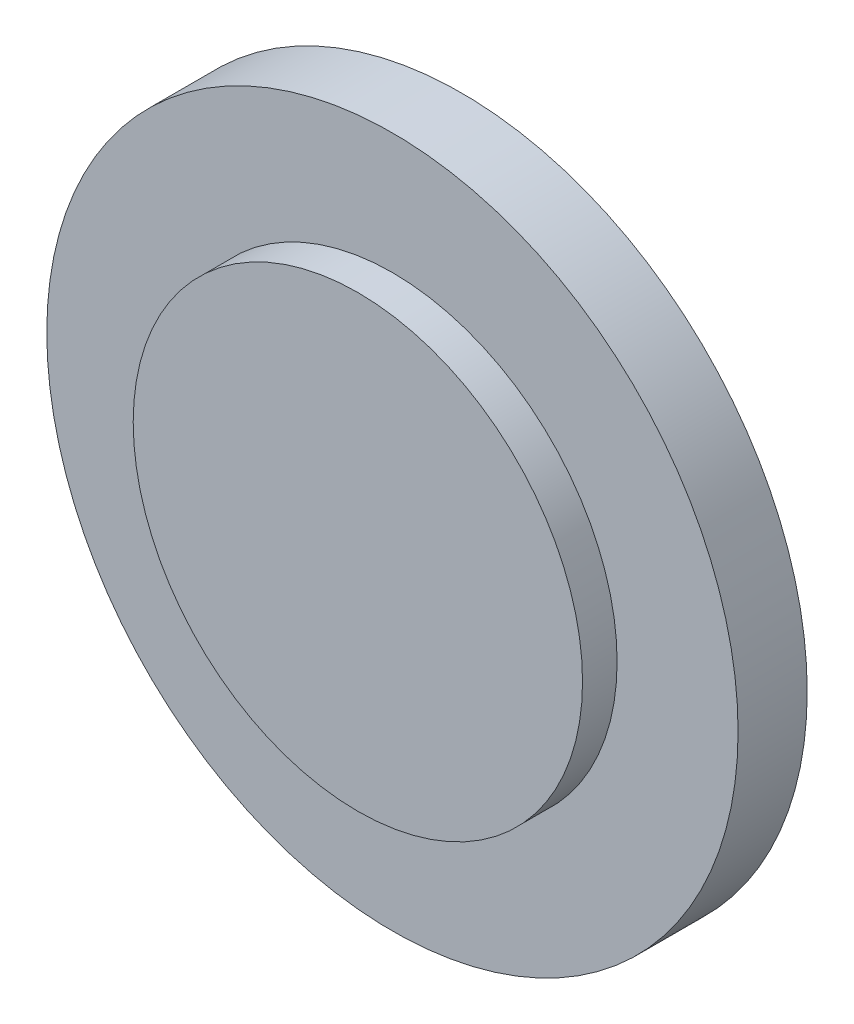
ISO-10303-21;
HEADER;
FILE_DESCRIPTION(('STEP AP214'),'2;1');
FILE_NAME('part.step','',(''),(''),'','','');
FILE_SCHEMA(('AUTOMOTIVE_DESIGN { 1 0 10303 214 1 1 1 1 }'));
ENDSEC;
DATA;
#1=APPLICATION_CONTEXT('core data for automotive mechanical design processes');
#2=APPLICATION_PROTOCOL_DEFINITION('international standard','automotive_design',2000,#1);
#3=PRODUCT_CONTEXT('',#1,'mechanical');
#4=PRODUCT('Part','Part','',(#3));
#5=PRODUCT_RELATED_PRODUCT_CATEGORY('part','',(#4));
#6=PRODUCT_DEFINITION_FORMATION('','',#4);
#7=PRODUCT_DEFINITION_CONTEXT('part definition',#1,'design');
#8=PRODUCT_DEFINITION('design','',#6,#7);
#9=PRODUCT_DEFINITION_SHAPE('','',#8);
#10=(LENGTH_UNIT() NAMED_UNIT(*) SI_UNIT(.MILLI.,.METRE.));
#11=(NAMED_UNIT(*) PLANE_ANGLE_UNIT() SI_UNIT($,.RADIAN.));
#12=(NAMED_UNIT(*) SI_UNIT($,.STERADIAN.) SOLID_ANGLE_UNIT());
#13=UNCERTAINTY_MEASURE_WITH_UNIT(LENGTH_MEASURE(1.E-05),#10,'distance_accuracy_value','');
#14=(GEOMETRIC_REPRESENTATION_CONTEXT(3) GLOBAL_UNCERTAINTY_ASSIGNED_CONTEXT((#13)) GLOBAL_UNIT_ASSIGNED_CONTEXT((#10,
#11,#12)) REPRESENTATION_CONTEXT('',''));
#15=CARTESIAN_POINT('',(0.,0.,0.));
#16=DIRECTION('',(0.,0.,1.));
#17=DIRECTION('',(1.,0.,0.));
#18=AXIS2_PLACEMENT_3D('',#15,#16,#17);
#19=CARTESIAN_POINT('',(0.,0.,1.));
#20=DIRECTION('',(0.,0.,1.));
#21=DIRECTION('',(1.,0.,0.));
#22=AXIS2_PLACEMENT_3D('',#19,#20,#21);
#23=PLANE('',#22);
#24=CARTESIAN_POINT('',(0.,0.,1.));
#25=DIRECTION('',(0.,0.,1.));
#26=DIRECTION('',(1.,0.,0.));
#27=AXIS2_PLACEMENT_3D('',#24,#25,#26);
#28=CIRCLE('',#27,5.);
#29=CARTESIAN_POINT('',(5.,0.,1.));
#30=VERTEX_POINT('',#29);
#31=EDGE_CURVE('E10',#30,#30,#28,.T.);
#32=ORIENTED_EDGE('',*,*,#31,.T.);
#33=EDGE_LOOP('',(#32));
#34=FACE_BOUND('',#33,.T.);
#35=CARTESIAN_POINT('',(0.,0.,1.));
#36=DIRECTION('',(0.,0.,1.));
#37=DIRECTION('',(1.,0.,0.));
#38=AXIS2_PLACEMENT_3D('',#35,#36,#37);
#39=CIRCLE('',#38,3.25);
#40=CARTESIAN_POINT('',(3.25,0.,1.));
#41=VERTEX_POINT('',#40);
#42=EDGE_CURVE('E43',#41,#41,#39,.T.);
#43=ORIENTED_EDGE('',*,*,#42,.F.);
#44=EDGE_LOOP('',(#43));
#45=FACE_BOUND('',#44,.T.);
#46=ADVANCED_FACE('F30',(#34,#45),#23,.T.);
#47=CARTESIAN_POINT('',(0.,0.,1.));
#48=DIRECTION('',(0.,0.,-1.));
#49=DIRECTION('',(-1.,0.,0.));
#50=AXIS2_PLACEMENT_3D('',#47,#48,#49);
#51=CYLINDRICAL_SURFACE('',#50,5.);
#52=ORIENTED_EDGE('',*,*,#31,.F.);
#53=EDGE_LOOP('',(#52));
#54=FACE_BOUND('',#53,.T.);
#55=CARTESIAN_POINT('',(0.,0.,0.));
#56=DIRECTION('',(0.,0.,1.));
#57=DIRECTION('',(1.,0.,0.));
#58=AXIS2_PLACEMENT_3D('',#55,#56,#57);
#59=CIRCLE('',#58,5.);
#60=CARTESIAN_POINT('',(5.,0.,0.));
#61=VERTEX_POINT('',#60);
#62=EDGE_CURVE('E34',#61,#61,#59,.T.);
#63=ORIENTED_EDGE('',*,*,#62,.T.);
#64=EDGE_LOOP('',(#63));
#65=FACE_BOUND('',#64,.T.);
#66=ADVANCED_FACE('F32',(#54,#65),#51,.T.);
#67=CARTESIAN_POINT('',(0.,0.,0.));
#68=DIRECTION('',(0.,0.,1.));
#69=DIRECTION('',(1.,0.,0.));
#70=AXIS2_PLACEMENT_3D('',#67,#68,#69);
#71=PLANE('',#70);
#72=ORIENTED_EDGE('',*,*,#62,.F.);
#73=EDGE_LOOP('',(#72));
#74=FACE_BOUND('',#73,.T.);
#75=ADVANCED_FACE('F54',(#74),#71,.F.);
#76=CARTESIAN_POINT('',(0.,0.,1.5));
#77=DIRECTION('',(0.,0.,-1.));
#78=DIRECTION('',(-1.,0.,0.));
#79=AXIS2_PLACEMENT_3D('',#76,#77,#78);
#80=CYLINDRICAL_SURFACE('',#79,3.25);
#81=CARTESIAN_POINT('',(0.,0.,1.5));
#82=DIRECTION('',(0.,0.,1.));
#83=DIRECTION('',(1.,0.,0.));
#84=AXIS2_PLACEMENT_3D('',#81,#82,#83);
#85=CIRCLE('',#84,3.25);
#86=CARTESIAN_POINT('',(3.25,0.,1.5));
#87=VERTEX_POINT('',#86);
#88=EDGE_CURVE('E41',#87,#87,#85,.T.);
#89=ORIENTED_EDGE('',*,*,#88,.F.);
#90=EDGE_LOOP('',(#89));
#91=FACE_BOUND('',#90,.T.);
#92=ORIENTED_EDGE('',*,*,#42,.T.);
#93=EDGE_LOOP('',(#92));
#94=FACE_BOUND('',#93,.T.);
#95=ADVANCED_FACE('F51',(#91,#94),#80,.T.);
#96=CARTESIAN_POINT('',(0.,0.,1.5));
#97=DIRECTION('',(0.,0.,1.));
#98=DIRECTION('',(1.,0.,0.));
#99=AXIS2_PLACEMENT_3D('',#96,#97,#98);
#100=PLANE('',#99);
#101=ORIENTED_EDGE('',*,*,#88,.T.);
#102=EDGE_LOOP('',(#101));
#103=FACE_BOUND('',#102,.T.);
#104=ADVANCED_FACE('F49',(#103),#100,.T.);
#105=CLOSED_SHELL('',(#46,#66,#75,#95,#104));
#106=MANIFOLD_SOLID_BREP('B2',#105);
#107=ADVANCED_BREP_SHAPE_REPRESENTATION('',(#18,#106),#14);
#108=SHAPE_DEFINITION_REPRESENTATION(#9,#107);
ENDSEC;
END-ISO-10303-21;
